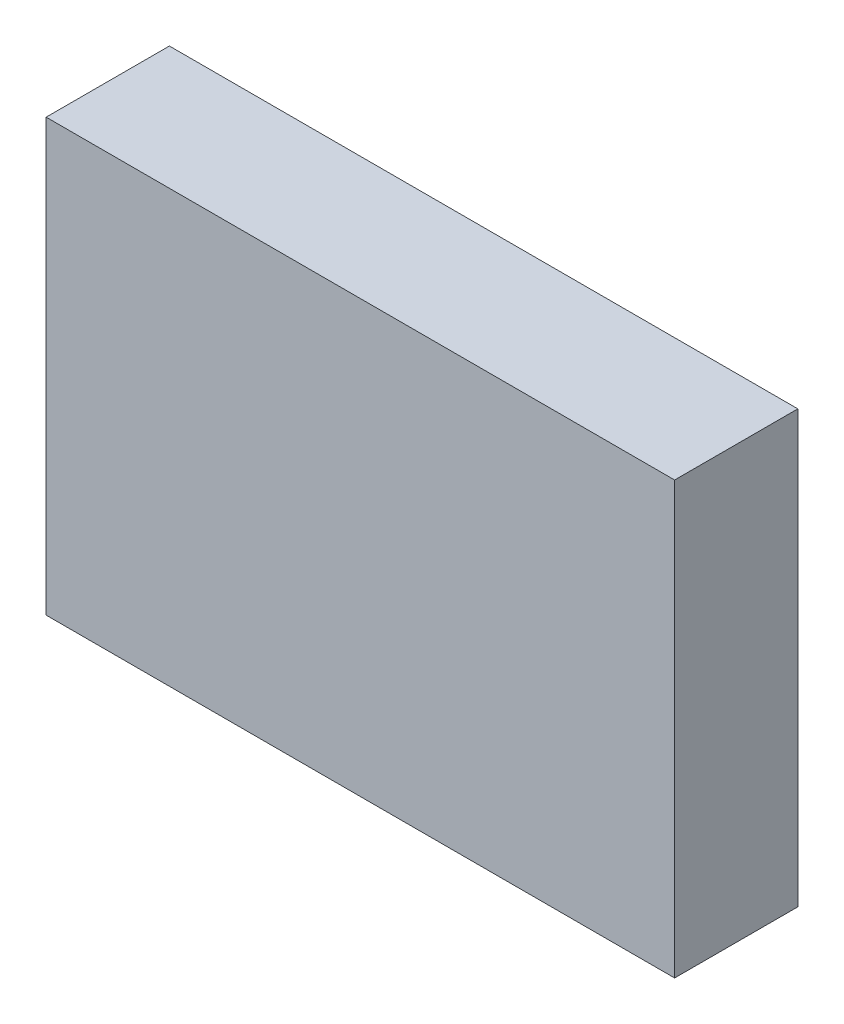
ISO-10303-21;
HEADER;
FILE_DESCRIPTION(('STEP AP214'),'2;1');
FILE_NAME('part.step','',(''),(''),'','','');
FILE_SCHEMA(('AUTOMOTIVE_DESIGN { 1 0 10303 214 1 1 1 1 }'));
ENDSEC;
DATA;
#1=APPLICATION_CONTEXT('core data for automotive mechanical design processes');
#2=APPLICATION_PROTOCOL_DEFINITION('international standard','automotive_design',2000,#1);
#3=PRODUCT_CONTEXT('',#1,'mechanical');
#4=PRODUCT('Part','Part','',(#3));
#5=PRODUCT_RELATED_PRODUCT_CATEGORY('part','',(#4));
#6=PRODUCT_DEFINITION_FORMATION('','',#4);
#7=PRODUCT_DEFINITION_CONTEXT('part definition',#1,'design');
#8=PRODUCT_DEFINITION('design','',#6,#7);
#9=PRODUCT_DEFINITION_SHAPE('','',#8);
#10=(LENGTH_UNIT() NAMED_UNIT(*) SI_UNIT(.MILLI.,.METRE.));
#11=(NAMED_UNIT(*) PLANE_ANGLE_UNIT() SI_UNIT($,.RADIAN.));
#12=(NAMED_UNIT(*) SI_UNIT($,.STERADIAN.) SOLID_ANGLE_UNIT());
#13=UNCERTAINTY_MEASURE_WITH_UNIT(LENGTH_MEASURE(1.E-05),#10,'distance_accuracy_value','');
#14=(GEOMETRIC_REPRESENTATION_CONTEXT(3) GLOBAL_UNCERTAINTY_ASSIGNED_CONTEXT((#13)) GLOBAL_UNIT_ASSIGNED_CONTEXT((#10,
#11,#12)) REPRESENTATION_CONTEXT('',''));
#15=CARTESIAN_POINT('',(0.,0.,0.));
#16=DIRECTION('',(0.,0.,1.));
#17=DIRECTION('',(1.,0.,0.));
#18=AXIS2_PLACEMENT_3D('',#15,#16,#17);
#19=CARTESIAN_POINT('',(0.,0.,5.));
#20=DIRECTION('',(1.,0.,0.));
#21=DIRECTION('',(0.,1.,0.));
#22=AXIS2_PLACEMENT_3D('',#19,#20,#21);
#23=PLANE('',#22);
#24=DIRECTION('',(0.,-1.,0.));
#25=VECTOR('',#24,1.);
#26=CARTESIAN_POINT('',(0.,0.,0.));
#27=LINE('',#26,#25);
#28=CARTESIAN_POINT('',(0.,0.,0.));
#29=VERTEX_POINT('',#28);
#30=CARTESIAN_POINT('',(0.,-17.5,0.));
#31=VERTEX_POINT('',#30);
#32=EDGE_CURVE('E113',#29,#31,#27,.T.);
#33=ORIENTED_EDGE('',*,*,#32,.T.);
#34=DIRECTION('',(0.,0.,-1.));
#35=VECTOR('',#34,1.);
#36=CARTESIAN_POINT('',(0.,-17.5,5.));
#37=LINE('',#36,#35);
#38=CARTESIAN_POINT('',(0.,-17.5,5.));
#39=VERTEX_POINT('',#38);
#40=EDGE_CURVE('E11',#39,#31,#37,.T.);
#41=ORIENTED_EDGE('',*,*,#40,.F.);
#42=DIRECTION('',(0.,-1.,0.));
#43=VECTOR('',#42,1.);
#44=CARTESIAN_POINT('',(0.,0.,5.));
#45=LINE('',#44,#43);
#46=CARTESIAN_POINT('',(0.,0.,5.));
#47=VERTEX_POINT('',#46);
#48=EDGE_CURVE('E97',#47,#39,#45,.T.);
#49=ORIENTED_EDGE('',*,*,#48,.F.);
#50=DIRECTION('',(0.,0.,-1.));
#51=VECTOR('',#50,1.);
#52=CARTESIAN_POINT('',(0.,0.,5.));
#53=LINE('',#52,#51);
#54=EDGE_CURVE('E109',#47,#29,#53,.T.);
#55=ORIENTED_EDGE('',*,*,#54,.T.);
#56=EDGE_LOOP('',(#33,#41,#49,#55));
#57=FACE_BOUND('',#56,.T.);
#58=ADVANCED_FACE('F45',(#57),#23,.F.);
#59=CARTESIAN_POINT('',(0.,-17.5,5.));
#60=DIRECTION('',(0.,1.,0.));
#61=DIRECTION('',(0.,0.,1.));
#62=AXIS2_PLACEMENT_3D('',#59,#60,#61);
#63=PLANE('',#62);
#64=DIRECTION('',(1.,0.,0.));
#65=VECTOR('',#64,1.);
#66=CARTESIAN_POINT('',(0.,-17.5,0.));
#67=LINE('',#66,#65);
#68=CARTESIAN_POINT('',(25.5,-17.5,0.));
#69=VERTEX_POINT('',#68);
#70=EDGE_CURVE('E102',#31,#69,#67,.T.);
#71=ORIENTED_EDGE('',*,*,#70,.T.);
#72=DIRECTION('',(0.,0.,-1.));
#73=VECTOR('',#72,1.);
#74=CARTESIAN_POINT('',(25.5,-17.5,5.));
#75=LINE('',#74,#73);
#76=CARTESIAN_POINT('',(25.5,-17.5,5.));
#77=VERTEX_POINT('',#76);
#78=EDGE_CURVE('E54',#77,#69,#75,.T.);
#79=ORIENTED_EDGE('',*,*,#78,.F.);
#80=DIRECTION('',(1.,0.,0.));
#81=VECTOR('',#80,1.);
#82=CARTESIAN_POINT('',(0.,-17.5,5.));
#83=LINE('',#82,#81);
#84=EDGE_CURVE('E92',#39,#77,#83,.T.);
#85=ORIENTED_EDGE('',*,*,#84,.F.);
#86=ORIENTED_EDGE('',*,*,#40,.T.);
#87=EDGE_LOOP('',(#71,#79,#85,#86));
#88=FACE_BOUND('',#87,.T.);
#89=ADVANCED_FACE('F101',(#88),#63,.F.);
#90=CARTESIAN_POINT('',(25.5,0.,5.));
#91=DIRECTION('',(-1.,0.,0.));
#92=DIRECTION('',(0.,-1.,0.));
#93=AXIS2_PLACEMENT_3D('',#90,#91,#92);
#94=PLANE('',#93);
#95=DIRECTION('',(0.,1.,0.));
#96=VECTOR('',#95,1.);
#97=CARTESIAN_POINT('',(25.5,0.,0.));
#98=LINE('',#97,#96);
#99=CARTESIAN_POINT('',(25.5,0.,0.));
#100=VERTEX_POINT('',#99);
#101=EDGE_CURVE('E79',#69,#100,#98,.T.);
#102=ORIENTED_EDGE('',*,*,#101,.T.);
#103=DIRECTION('',(0.,0.,-1.));
#104=VECTOR('',#103,1.);
#105=CARTESIAN_POINT('',(25.5,0.,5.));
#106=LINE('',#105,#104);
#107=CARTESIAN_POINT('',(25.5,0.,5.));
#108=VERTEX_POINT('',#107);
#109=EDGE_CURVE('E104',#108,#100,#106,.T.);
#110=ORIENTED_EDGE('',*,*,#109,.F.);
#111=DIRECTION('',(0.,1.,0.));
#112=VECTOR('',#111,1.);
#113=CARTESIAN_POINT('',(25.5,0.,5.));
#114=LINE('',#113,#112);
#115=EDGE_CURVE('E95',#77,#108,#114,.T.);
#116=ORIENTED_EDGE('',*,*,#115,.F.);
#117=ORIENTED_EDGE('',*,*,#78,.T.);
#118=EDGE_LOOP('',(#102,#110,#116,#117));
#119=FACE_BOUND('',#118,.T.);
#120=ADVANCED_FACE('F105',(#119),#94,.F.);
#121=CARTESIAN_POINT('',(0.,0.,5.));
#122=DIRECTION('',(0.,-1.,0.));
#123=DIRECTION('',(0.,0.,-1.));
#124=AXIS2_PLACEMENT_3D('',#121,#122,#123);
#125=PLANE('',#124);
#126=DIRECTION('',(-1.,0.,0.));
#127=VECTOR('',#126,1.);
#128=CARTESIAN_POINT('',(0.,0.,0.));
#129=LINE('',#128,#127);
#130=EDGE_CURVE('E85',#100,#29,#129,.T.);
#131=ORIENTED_EDGE('',*,*,#130,.T.);
#132=ORIENTED_EDGE('',*,*,#54,.F.);
#133=DIRECTION('',(-1.,0.,0.));
#134=VECTOR('',#133,1.);
#135=CARTESIAN_POINT('',(0.,0.,5.));
#136=LINE('',#135,#134);
#137=EDGE_CURVE('E62',#108,#47,#136,.T.);
#138=ORIENTED_EDGE('',*,*,#137,.F.);
#139=ORIENTED_EDGE('',*,*,#109,.T.);
#140=EDGE_LOOP('',(#131,#132,#138,#139));
#141=FACE_BOUND('',#140,.T.);
#142=ADVANCED_FACE('F126',(#141),#125,.F.);
#143=CARTESIAN_POINT('',(0.,0.,5.));
#144=DIRECTION('',(0.,0.,1.));
#145=DIRECTION('',(1.,0.,0.));
#146=AXIS2_PLACEMENT_3D('',#143,#144,#145);
#147=PLANE('',#146);
#148=ORIENTED_EDGE('',*,*,#48,.T.);
#149=ORIENTED_EDGE('',*,*,#84,.T.);
#150=ORIENTED_EDGE('',*,*,#115,.T.);
#151=ORIENTED_EDGE('',*,*,#137,.T.);
#152=EDGE_LOOP('',(#148,#149,#150,#151));
#153=FACE_BOUND('',#152,.T.);
#154=ADVANCED_FACE('F93',(#153),#147,.T.);
#155=CARTESIAN_POINT('',(0.,0.,0.));
#156=DIRECTION('',(0.,0.,1.));
#157=DIRECTION('',(1.,0.,0.));
#158=AXIS2_PLACEMENT_3D('',#155,#156,#157);
#159=PLANE('',#158);
#160=ORIENTED_EDGE('',*,*,#32,.F.);
#161=ORIENTED_EDGE('',*,*,#130,.F.);
#162=ORIENTED_EDGE('',*,*,#101,.F.);
#163=ORIENTED_EDGE('',*,*,#70,.F.);
#164=EDGE_LOOP('',(#160,#161,#162,#163));
#165=FACE_BOUND('',#164,.T.);
#166=ADVANCED_FACE('F129',(#165),#159,.F.);
#167=CLOSED_SHELL('',(#58,#89,#120,#142,#154,#166));
#168=MANIFOLD_SOLID_BREP('B2',#167);
#169=ADVANCED_BREP_SHAPE_REPRESENTATION('',(#18,#168),#14);
#170=SHAPE_DEFINITION_REPRESENTATION(#9,#169);
ENDSEC;
END-ISO-10303-21;
